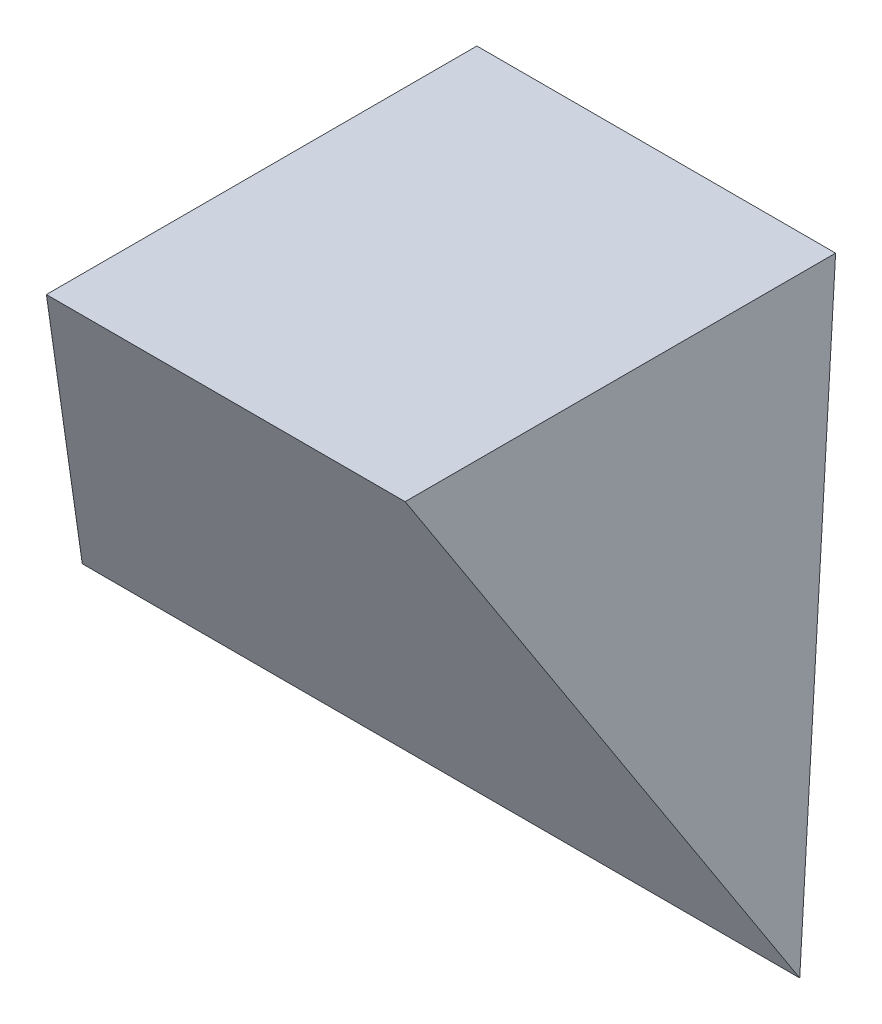
ISO-10303-21;
HEADER;
FILE_DESCRIPTION(('STEP AP214'),'2;1');
FILE_NAME('part.step','',(''),(''),'','','');
FILE_SCHEMA(('AUTOMOTIVE_DESIGN { 1 0 10303 214 1 1 1 1 }'));
ENDSEC;
DATA;
#1=APPLICATION_CONTEXT('core data for automotive mechanical design processes');
#2=APPLICATION_PROTOCOL_DEFINITION('international standard','automotive_design',2000,#1);
#3=PRODUCT_CONTEXT('',#1,'mechanical');
#4=PRODUCT('Part','Part','',(#3));
#5=PRODUCT_RELATED_PRODUCT_CATEGORY('part','',(#4));
#6=PRODUCT_DEFINITION_FORMATION('','',#4);
#7=PRODUCT_DEFINITION_CONTEXT('part definition',#1,'design');
#8=PRODUCT_DEFINITION('design','',#6,#7);
#9=PRODUCT_DEFINITION_SHAPE('','',#8);
#10=(LENGTH_UNIT() NAMED_UNIT(*) SI_UNIT(.MILLI.,.METRE.));
#11=(NAMED_UNIT(*) PLANE_ANGLE_UNIT() SI_UNIT($,.RADIAN.));
#12=(NAMED_UNIT(*) SI_UNIT($,.STERADIAN.) SOLID_ANGLE_UNIT());
#13=UNCERTAINTY_MEASURE_WITH_UNIT(LENGTH_MEASURE(1.E-05),#10,'distance_accuracy_value','');
#14=(GEOMETRIC_REPRESENTATION_CONTEXT(3) GLOBAL_UNCERTAINTY_ASSIGNED_CONTEXT((#13)) GLOBAL_UNIT_ASSIGNED_CONTEXT((#10,
#11,#12)) REPRESENTATION_CONTEXT('',''));
#15=CARTESIAN_POINT('',(0.,0.,0.));
#16=DIRECTION('',(0.,0.,1.));
#17=DIRECTION('',(1.,0.,0.));
#18=AXIS2_PLACEMENT_3D('',#15,#16,#17);
#19=CARTESIAN_POINT('',(0.,0.,0.));
#20=DIRECTION('',(0.923076923076923,-0.384615384615385,0.));
#21=DIRECTION('',(0.384615384615385,0.923076923076923,0.));
#22=AXIS2_PLACEMENT_3D('',#19,#20,#21);
#23=PLANE('',#22);
#24=DIRECTION('',(-0.349215147884789,-0.838116354923494,-0.419058177461747));
#25=VECTOR('',#24,1.);
#26=CARTESIAN_POINT('',(-4.39024390243903,-10.5365853658537,24.7317073170732));
#27=LINE('',#26,#25);
#28=CARTESIAN_POINT('',(25.,60.,60.));
#29=VERTEX_POINT('',#28);
#30=CARTESIAN_POINT('',(0.,0.,30.));
#31=VERTEX_POINT('',#30);
#32=EDGE_CURVE('E109',#29,#31,#27,.T.);
#33=ORIENTED_EDGE('',*,*,#32,.F.);
#34=CARTESIAN_POINT('',(25.,60.,0.));
#35=DIRECTION('',(0.,0.,1.));
#36=VECTOR('',#35,1.);
#37=LINE('',#34,#36);
#38=CARTESIAN_POINT('',(25.,60.,0.));
#39=VERTEX_POINT('',#38);
#40=EDGE_CURVE('E79',#39,#29,#37,.T.);
#41=ORIENTED_EDGE('',*,*,#40,.F.);
#42=DIRECTION('',(0.349215147884789,0.838116354923494,-0.419058177461747));
#43=VECTOR('',#42,1.);
#44=CARTESIAN_POINT('',(4.39024390243903,10.5365853658537,24.7317073170732));
#45=LINE('',#44,#43);
#46=EDGE_CURVE('E86',#31,#39,#45,.T.);
#47=ORIENTED_EDGE('',*,*,#46,.F.);
#48=EDGE_LOOP('',(#33,#41,#47));
#49=FACE_BOUND('',#48,.T.);
#50=ADVANCED_FACE('F69',(#49),#23,.F.);
#51=CARTESIAN_POINT('',(85.207100591716,35.5029585798817,0.));
#52=DIRECTION('',(-0.923076923076923,-0.384615384615385,0.));
#53=DIRECTION('',(0.384615384615385,-0.923076923076923,0.));
#54=AXIS2_PLACEMENT_3D('',#51,#52,#53);
#55=PLANE('',#54);
#56=DIRECTION('',(-0.349215147884789,0.838116354923494,0.419058177461747));
#57=VECTOR('',#56,1.);
#58=CARTESIAN_POINT('',(92.1951219512195,18.7317073170732,39.3658536585366));
#59=LINE('',#58,#57);
#60=CARTESIAN_POINT('',(100.,0.,30.));
#61=VERTEX_POINT('',#60);
#62=CARTESIAN_POINT('',(75.,60.,60.));
#63=VERTEX_POINT('',#62);
#64=EDGE_CURVE('E111',#61,#63,#59,.T.);
#65=ORIENTED_EDGE('',*,*,#64,.F.);
#66=DIRECTION('',(0.349215147884789,-0.838116354923494,0.419058177461747));
#67=VECTOR('',#66,1.);
#68=CARTESIAN_POINT('',(83.4146341463415,39.8048780487805,10.0975609756098));
#69=LINE('',#68,#67);
#70=CARTESIAN_POINT('',(75.,60.,0.));
#71=VERTEX_POINT('',#70);
#72=EDGE_CURVE('E160',#71,#61,#69,.T.);
#73=ORIENTED_EDGE('',*,*,#72,.F.);
#74=CARTESIAN_POINT('',(75.,60.,0.));
#75=DIRECTION('',(0.,0.,1.));
#76=VECTOR('',#75,1.);
#77=LINE('',#74,#76);
#78=EDGE_CURVE('E125',#71,#63,#77,.T.);
#79=ORIENTED_EDGE('',*,*,#78,.T.);
#80=EDGE_LOOP('',(#65,#73,#79));
#81=FACE_BOUND('',#80,.T.);
#82=ADVANCED_FACE('F183',(#81),#55,.F.);
#83=CARTESIAN_POINT('',(0.,60.,0.));
#84=DIRECTION('',(0.,-1.,0.));
#85=DIRECTION('',(0.,0.,-1.));
#86=AXIS2_PLACEMENT_3D('',#83,#84,#85);
#87=PLANE('',#86);
#88=ORIENTED_EDGE('',*,*,#40,.T.);
#89=DIRECTION('',(-1.,0.,0.));
#90=VECTOR('',#89,1.);
#91=CARTESIAN_POINT('',(75.,60.,60.));
#92=LINE('',#91,#90);
#93=EDGE_CURVE('E12',#63,#29,#92,.T.);
#94=ORIENTED_EDGE('',*,*,#93,.F.);
#95=ORIENTED_EDGE('',*,*,#78,.F.);
#96=DIRECTION('',(-1.,0.,0.));
#97=VECTOR('',#96,1.);
#98=CARTESIAN_POINT('',(75.,60.,0.));
#99=LINE('',#98,#97);
#100=EDGE_CURVE('E91',#71,#39,#99,.T.);
#101=ORIENTED_EDGE('',*,*,#100,.T.);
#102=EDGE_LOOP('',(#88,#94,#95,#101));
#103=FACE_BOUND('',#102,.T.);
#104=ADVANCED_FACE('F71',(#103),#87,.F.);
#105=CARTESIAN_POINT('',(0.,12.,24.));
#106=DIRECTION('',(0.,-0.447213595499958,-0.894427190999916));
#107=DIRECTION('',(0.,0.894427190999916,-0.447213595499958));
#108=AXIS2_PLACEMENT_3D('',#105,#106,#107);
#109=PLANE('',#108);
#110=ORIENTED_EDGE('',*,*,#46,.T.);
#111=ORIENTED_EDGE('',*,*,#100,.F.);
#112=ORIENTED_EDGE('',*,*,#72,.T.);
#113=DIRECTION('',(-1.,0.,0.));
#114=VECTOR('',#113,1.);
#115=CARTESIAN_POINT('',(0.,0.,30.));
#116=LINE('',#115,#114);
#117=EDGE_CURVE('E121',#61,#31,#116,.T.);
#118=ORIENTED_EDGE('',*,*,#117,.T.);
#119=EDGE_LOOP('',(#110,#111,#112,#118));
#120=FACE_BOUND('',#119,.T.);
#121=ADVANCED_FACE('F184',(#120),#109,.T.);
#122=CARTESIAN_POINT('',(0.,-12.,24.));
#123=DIRECTION('',(0.,-0.447213595499958,0.894427190999916));
#124=DIRECTION('',(0.,-0.894427190999916,-0.447213595499958));
#125=AXIS2_PLACEMENT_3D('',#122,#123,#124);
#126=PLANE('',#125);
#127=ORIENTED_EDGE('',*,*,#32,.T.);
#128=ORIENTED_EDGE('',*,*,#117,.F.);
#129=ORIENTED_EDGE('',*,*,#64,.T.);
#130=ORIENTED_EDGE('',*,*,#93,.T.);
#131=EDGE_LOOP('',(#127,#128,#129,#130));
#132=FACE_BOUND('',#131,.T.);
#133=ADVANCED_FACE('F108',(#132),#126,.T.);
#134=CLOSED_SHELL('',(#50,#82,#104,#121,#133));
#135=MANIFOLD_SOLID_BREP('B2',#134);
#136=ADVANCED_BREP_SHAPE_REPRESENTATION('',(#18,#135),#14);
#137=SHAPE_DEFINITION_REPRESENTATION(#9,#136);
ENDSEC;
END-ISO-10303-21;
